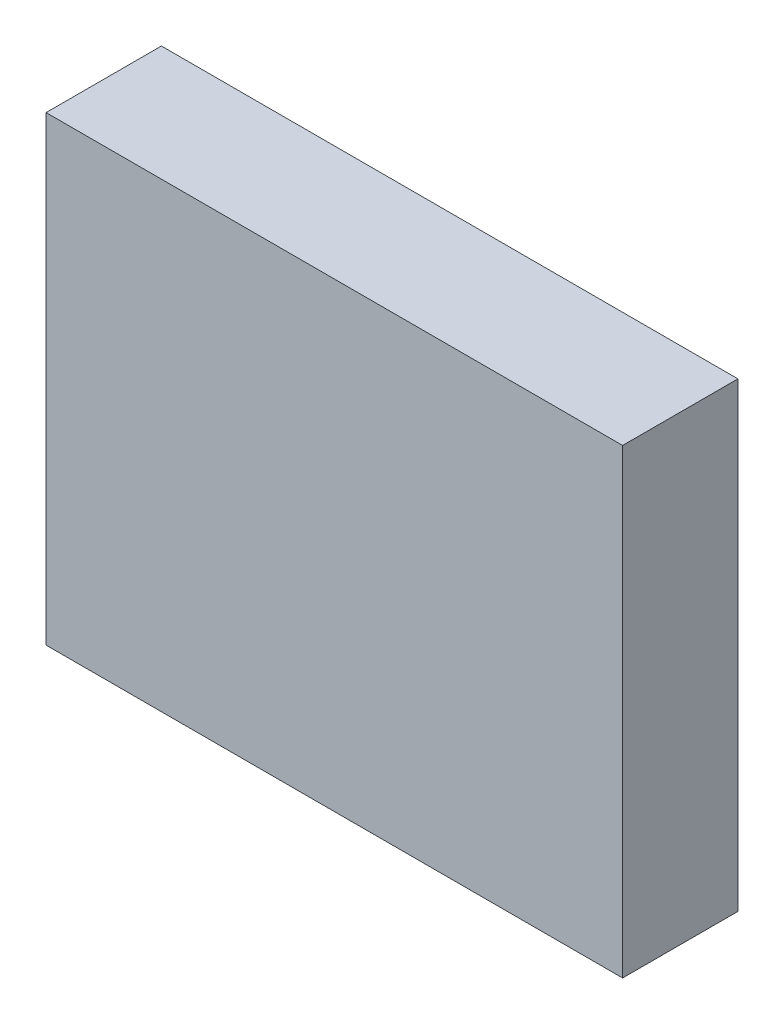
ISO-10303-21;
HEADER;
FILE_DESCRIPTION(('STEP AP214'),'2;1');
FILE_NAME('part.step','',(''),(''),'','','');
FILE_SCHEMA(('AUTOMOTIVE_DESIGN { 1 0 10303 214 1 1 1 1 }'));
ENDSEC;
DATA;
#1=APPLICATION_CONTEXT('core data for automotive mechanical design processes');
#2=APPLICATION_PROTOCOL_DEFINITION('international standard','automotive_design',2000,#1);
#3=PRODUCT_CONTEXT('',#1,'mechanical');
#4=PRODUCT('Part','Part','',(#3));
#5=PRODUCT_RELATED_PRODUCT_CATEGORY('part','',(#4));
#6=PRODUCT_DEFINITION_FORMATION('','',#4);
#7=PRODUCT_DEFINITION_CONTEXT('part definition',#1,'design');
#8=PRODUCT_DEFINITION('design','',#6,#7);
#9=PRODUCT_DEFINITION_SHAPE('','',#8);
#10=(LENGTH_UNIT() NAMED_UNIT(*) SI_UNIT(.MILLI.,.METRE.));
#11=(NAMED_UNIT(*) PLANE_ANGLE_UNIT() SI_UNIT($,.RADIAN.));
#12=(NAMED_UNIT(*) SI_UNIT($,.STERADIAN.) SOLID_ANGLE_UNIT());
#13=UNCERTAINTY_MEASURE_WITH_UNIT(LENGTH_MEASURE(1.E-05),#10,'distance_accuracy_value','');
#14=(GEOMETRIC_REPRESENTATION_CONTEXT(3) GLOBAL_UNCERTAINTY_ASSIGNED_CONTEXT((#13)) GLOBAL_UNIT_ASSIGNED_CONTEXT((#10,
#11,#12)) REPRESENTATION_CONTEXT('',''));
#15=CARTESIAN_POINT('',(0.,0.,0.));
#16=DIRECTION('',(0.,0.,1.));
#17=DIRECTION('',(1.,0.,0.));
#18=AXIS2_PLACEMENT_3D('',#15,#16,#17);
#19=CARTESIAN_POINT('',(50.,-40.,20.));
#20=DIRECTION('',(-1.,0.,0.));
#21=DIRECTION('',(0.,0.,1.));
#22=AXIS2_PLACEMENT_3D('',#19,#20,#21);
#23=PLANE('',#22);
#24=DIRECTION('',(0.,1.,0.));
#25=VECTOR('',#24,1.);
#26=CARTESIAN_POINT('',(50.,-40.,0.));
#27=LINE('',#26,#25);
#28=CARTESIAN_POINT('',(50.,-40.,0.));
#29=VERTEX_POINT('',#28);
#30=CARTESIAN_POINT('',(50.,40.,0.));
#31=VERTEX_POINT('',#30);
#32=EDGE_CURVE('E113',#29,#31,#27,.T.);
#33=ORIENTED_EDGE('',*,*,#32,.T.);
#34=DIRECTION('',(0.,0.,-1.));
#35=VECTOR('',#34,1.);
#36=CARTESIAN_POINT('',(50.,40.,20.));
#37=LINE('',#36,#35);
#38=CARTESIAN_POINT('',(50.,40.,20.));
#39=VERTEX_POINT('',#38);
#40=EDGE_CURVE('E11',#39,#31,#37,.T.);
#41=ORIENTED_EDGE('',*,*,#40,.F.);
#42=DIRECTION('',(0.,1.,0.));
#43=VECTOR('',#42,1.);
#44=CARTESIAN_POINT('',(50.,-40.,20.));
#45=LINE('',#44,#43);
#46=CARTESIAN_POINT('',(50.,-40.,20.));
#47=VERTEX_POINT('',#46);
#48=EDGE_CURVE('E97',#47,#39,#45,.T.);
#49=ORIENTED_EDGE('',*,*,#48,.F.);
#50=DIRECTION('',(0.,0.,-1.));
#51=VECTOR('',#50,1.);
#52=CARTESIAN_POINT('',(50.,-40.,20.));
#53=LINE('',#52,#51);
#54=EDGE_CURVE('E109',#47,#29,#53,.T.);
#55=ORIENTED_EDGE('',*,*,#54,.T.);
#56=EDGE_LOOP('',(#33,#41,#49,#55));
#57=FACE_BOUND('',#56,.T.);
#58=ADVANCED_FACE('F45',(#57),#23,.F.);
#59=CARTESIAN_POINT('',(-50.,40.,20.));
#60=DIRECTION('',(0.,-1.,0.));
#61=DIRECTION('',(0.,0.,-1.));
#62=AXIS2_PLACEMENT_3D('',#59,#60,#61);
#63=PLANE('',#62);
#64=DIRECTION('',(-1.,0.,0.));
#65=VECTOR('',#64,1.);
#66=CARTESIAN_POINT('',(-50.,40.,0.));
#67=LINE('',#66,#65);
#68=CARTESIAN_POINT('',(-50.,40.,0.));
#69=VERTEX_POINT('',#68);
#70=EDGE_CURVE('E102',#31,#69,#67,.T.);
#71=ORIENTED_EDGE('',*,*,#70,.T.);
#72=DIRECTION('',(0.,0.,-1.));
#73=VECTOR('',#72,1.);
#74=CARTESIAN_POINT('',(-50.,40.,20.));
#75=LINE('',#74,#73);
#76=CARTESIAN_POINT('',(-50.,40.,20.));
#77=VERTEX_POINT('',#76);
#78=EDGE_CURVE('E54',#77,#69,#75,.T.);
#79=ORIENTED_EDGE('',*,*,#78,.F.);
#80=DIRECTION('',(-1.,0.,0.));
#81=VECTOR('',#80,1.);
#82=CARTESIAN_POINT('',(-50.,40.,20.));
#83=LINE('',#82,#81);
#84=EDGE_CURVE('E92',#39,#77,#83,.T.);
#85=ORIENTED_EDGE('',*,*,#84,.F.);
#86=ORIENTED_EDGE('',*,*,#40,.T.);
#87=EDGE_LOOP('',(#71,#79,#85,#86));
#88=FACE_BOUND('',#87,.T.);
#89=ADVANCED_FACE('F101',(#88),#63,.F.);
#90=CARTESIAN_POINT('',(-50.,-40.,20.));
#91=DIRECTION('',(1.,0.,0.));
#92=DIRECTION('',(0.,0.,-1.));
#93=AXIS2_PLACEMENT_3D('',#90,#91,#92);
#94=PLANE('',#93);
#95=DIRECTION('',(0.,-1.,0.));
#96=VECTOR('',#95,1.);
#97=CARTESIAN_POINT('',(-50.,-40.,0.));
#98=LINE('',#97,#96);
#99=CARTESIAN_POINT('',(-50.,-40.,0.));
#100=VERTEX_POINT('',#99);
#101=EDGE_CURVE('E79',#69,#100,#98,.T.);
#102=ORIENTED_EDGE('',*,*,#101,.T.);
#103=DIRECTION('',(0.,0.,-1.));
#104=VECTOR('',#103,1.);
#105=CARTESIAN_POINT('',(-50.,-40.,20.));
#106=LINE('',#105,#104);
#107=CARTESIAN_POINT('',(-50.,-40.,20.));
#108=VERTEX_POINT('',#107);
#109=EDGE_CURVE('E104',#108,#100,#106,.T.);
#110=ORIENTED_EDGE('',*,*,#109,.F.);
#111=DIRECTION('',(0.,-1.,0.));
#112=VECTOR('',#111,1.);
#113=CARTESIAN_POINT('',(-50.,-40.,20.));
#114=LINE('',#113,#112);
#115=EDGE_CURVE('E95',#77,#108,#114,.T.);
#116=ORIENTED_EDGE('',*,*,#115,.F.);
#117=ORIENTED_EDGE('',*,*,#78,.T.);
#118=EDGE_LOOP('',(#102,#110,#116,#117));
#119=FACE_BOUND('',#118,.T.);
#120=ADVANCED_FACE('F105',(#119),#94,.F.);
#121=CARTESIAN_POINT('',(-50.,-40.,20.));
#122=DIRECTION('',(0.,1.,0.));
#123=DIRECTION('',(0.,0.,1.));
#124=AXIS2_PLACEMENT_3D('',#121,#122,#123);
#125=PLANE('',#124);
#126=DIRECTION('',(1.,0.,0.));
#127=VECTOR('',#126,1.);
#128=CARTESIAN_POINT('',(-50.,-40.,0.));
#129=LINE('',#128,#127);
#130=EDGE_CURVE('E85',#100,#29,#129,.T.);
#131=ORIENTED_EDGE('',*,*,#130,.T.);
#132=ORIENTED_EDGE('',*,*,#54,.F.);
#133=DIRECTION('',(1.,0.,0.));
#134=VECTOR('',#133,1.);
#135=CARTESIAN_POINT('',(-50.,-40.,20.));
#136=LINE('',#135,#134);
#137=EDGE_CURVE('E62',#108,#47,#136,.T.);
#138=ORIENTED_EDGE('',*,*,#137,.F.);
#139=ORIENTED_EDGE('',*,*,#109,.T.);
#140=EDGE_LOOP('',(#131,#132,#138,#139));
#141=FACE_BOUND('',#140,.T.);
#142=ADVANCED_FACE('F126',(#141),#125,.F.);
#143=CARTESIAN_POINT('',(0.,0.,20.));
#144=DIRECTION('',(0.,0.,-1.));
#145=DIRECTION('',(-1.,0.,0.));
#146=AXIS2_PLACEMENT_3D('',#143,#144,#145);
#147=PLANE('',#146);
#148=ORIENTED_EDGE('',*,*,#48,.T.);
#149=ORIENTED_EDGE('',*,*,#84,.T.);
#150=ORIENTED_EDGE('',*,*,#115,.T.);
#151=ORIENTED_EDGE('',*,*,#137,.T.);
#152=EDGE_LOOP('',(#148,#149,#150,#151));
#153=FACE_BOUND('',#152,.T.);
#154=ADVANCED_FACE('F93',(#153),#147,.F.);
#155=CARTESIAN_POINT('',(0.,0.,0.));
#156=DIRECTION('',(0.,0.,-1.));
#157=DIRECTION('',(-1.,0.,0.));
#158=AXIS2_PLACEMENT_3D('',#155,#156,#157);
#159=PLANE('',#158);
#160=ORIENTED_EDGE('',*,*,#32,.F.);
#161=ORIENTED_EDGE('',*,*,#130,.F.);
#162=ORIENTED_EDGE('',*,*,#101,.F.);
#163=ORIENTED_EDGE('',*,*,#70,.F.);
#164=EDGE_LOOP('',(#160,#161,#162,#163));
#165=FACE_BOUND('',#164,.T.);
#166=ADVANCED_FACE('F129',(#165),#159,.T.);
#167=CLOSED_SHELL('',(#58,#89,#120,#142,#154,#166));
#168=MANIFOLD_SOLID_BREP('B2',#167);
#169=ADVANCED_BREP_SHAPE_REPRESENTATION('',(#18,#168),#14);
#170=SHAPE_DEFINITION_REPRESENTATION(#9,#169);
ENDSEC;
END-ISO-10303-21;
